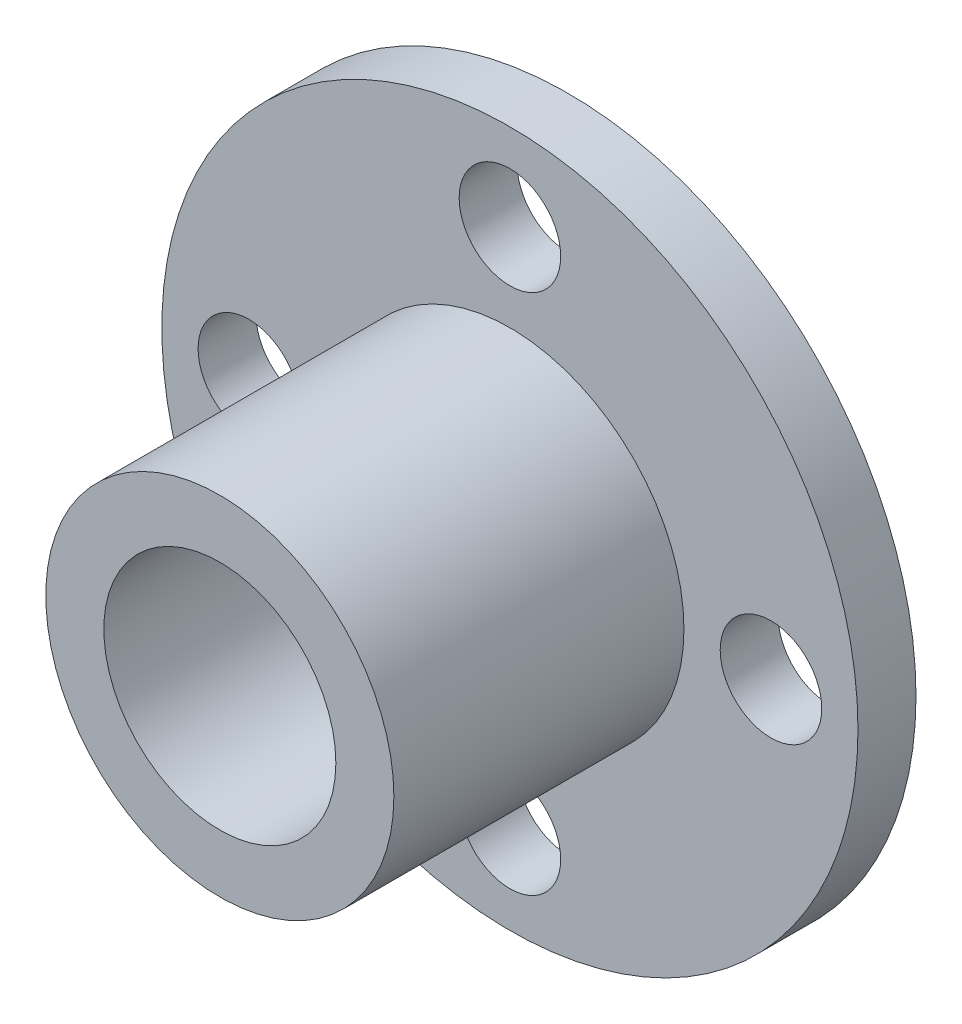
ISO-10303-21;
HEADER;
FILE_DESCRIPTION(('STEP AP214'),'2;1');
FILE_NAME('part.step','',(''),(''),'','','');
FILE_SCHEMA(('AUTOMOTIVE_DESIGN { 1 0 10303 214 1 1 1 1 }'));
ENDSEC;
DATA;
#1=APPLICATION_CONTEXT('core data for automotive mechanical design processes');
#2=APPLICATION_PROTOCOL_DEFINITION('international standard','automotive_design',2000,#1);
#3=PRODUCT_CONTEXT('',#1,'mechanical');
#4=PRODUCT('Part','Part','',(#3));
#5=PRODUCT_RELATED_PRODUCT_CATEGORY('part','',(#4));
#6=PRODUCT_DEFINITION_FORMATION('','',#4);
#7=PRODUCT_DEFINITION_CONTEXT('part definition',#1,'design');
#8=PRODUCT_DEFINITION('design','',#6,#7);
#9=PRODUCT_DEFINITION_SHAPE('','',#8);
#10=(LENGTH_UNIT() NAMED_UNIT(*) SI_UNIT(.MILLI.,.METRE.));
#11=(NAMED_UNIT(*) PLANE_ANGLE_UNIT() SI_UNIT($,.RADIAN.));
#12=(NAMED_UNIT(*) SI_UNIT($,.STERADIAN.) SOLID_ANGLE_UNIT());
#13=UNCERTAINTY_MEASURE_WITH_UNIT(LENGTH_MEASURE(1.E-05),#10,'distance_accuracy_value','');
#14=(GEOMETRIC_REPRESENTATION_CONTEXT(3) GLOBAL_UNCERTAINTY_ASSIGNED_CONTEXT((#13)) GLOBAL_UNIT_ASSIGNED_CONTEXT((#10,
#11,#12)) REPRESENTATION_CONTEXT('',''));
#15=CARTESIAN_POINT('',(0.,0.,0.));
#16=DIRECTION('',(0.,0.,1.));
#17=DIRECTION('',(1.,0.,0.));
#18=AXIS2_PLACEMENT_3D('',#15,#16,#17);
#19=CARTESIAN_POINT('',(0.,0.,2.));
#20=DIRECTION('',(0.,0.,1.));
#21=DIRECTION('',(1.,0.,0.));
#22=AXIS2_PLACEMENT_3D('',#19,#20,#21);
#23=PLANE('',#22);
#24=CARTESIAN_POINT('',(-9.,0.,2.));
#25=DIRECTION('',(0.,0.,1.));
#26=DIRECTION('',(1.,0.,0.));
#27=AXIS2_PLACEMENT_3D('',#24,#25,#26);
#28=CIRCLE('',#27,1.75);
#29=CARTESIAN_POINT('',(-7.25,0.,2.));
#30=VERTEX_POINT('',#29);
#31=EDGE_CURVE('E57',#30,#30,#28,.T.);
#32=ORIENTED_EDGE('',*,*,#31,.F.);
#33=EDGE_LOOP('',(#32));
#34=FACE_BOUND('',#33,.T.);
#35=CARTESIAN_POINT('',(0.,9.,2.));
#36=DIRECTION('',(0.,0.,1.));
#37=DIRECTION('',(1.,0.,0.));
#38=AXIS2_PLACEMENT_3D('',#35,#36,#37);
#39=CIRCLE('',#38,1.75);
#40=CARTESIAN_POINT('',(1.75,9.,2.));
#41=VERTEX_POINT('',#40);
#42=EDGE_CURVE('E60',#41,#41,#39,.T.);
#43=ORIENTED_EDGE('',*,*,#42,.F.);
#44=EDGE_LOOP('',(#43));
#45=FACE_BOUND('',#44,.T.);
#46=CARTESIAN_POINT('',(9.,0.,2.));
#47=DIRECTION('',(0.,0.,1.));
#48=DIRECTION('',(1.,0.,0.));
#49=AXIS2_PLACEMENT_3D('',#46,#47,#48);
#50=CIRCLE('',#49,1.75);
#51=CARTESIAN_POINT('',(10.75,0.,2.));
#52=VERTEX_POINT('',#51);
#53=EDGE_CURVE('E63',#52,#52,#50,.T.);
#54=ORIENTED_EDGE('',*,*,#53,.F.);
#55=EDGE_LOOP('',(#54));
#56=FACE_BOUND('',#55,.T.);
#57=CARTESIAN_POINT('',(0.,-9.,2.));
#58=DIRECTION('',(0.,0.,1.));
#59=DIRECTION('',(1.,0.,0.));
#60=AXIS2_PLACEMENT_3D('',#57,#58,#59);
#61=CIRCLE('',#60,1.75);
#62=CARTESIAN_POINT('',(1.75000000000006,-9.,2.));
#63=VERTEX_POINT('',#62);
#64=EDGE_CURVE('E66',#63,#63,#61,.T.);
#65=ORIENTED_EDGE('',*,*,#64,.F.);
#66=EDGE_LOOP('',(#65));
#67=FACE_BOUND('',#66,.T.);
#68=CARTESIAN_POINT('',(0.,0.,2.));
#69=DIRECTION('',(0.,0.,1.));
#70=DIRECTION('',(1.,0.,0.));
#71=AXIS2_PLACEMENT_3D('',#68,#69,#70);
#72=CIRCLE('',#71,12.);
#73=CARTESIAN_POINT('',(12.,0.,2.));
#74=VERTEX_POINT('',#73);
#75=EDGE_CURVE('E10',#74,#74,#72,.T.);
#76=ORIENTED_EDGE('',*,*,#75,.T.);
#77=EDGE_LOOP('',(#76));
#78=FACE_BOUND('',#77,.T.);
#79=CARTESIAN_POINT('',(0.,0.,2.));
#80=DIRECTION('',(0.,0.,1.));
#81=DIRECTION('',(1.,0.,0.));
#82=AXIS2_PLACEMENT_3D('',#79,#80,#81);
#83=CIRCLE('',#82,6.);
#84=CARTESIAN_POINT('',(6.,0.,2.));
#85=VERTEX_POINT('',#84);
#86=EDGE_CURVE('E49',#85,#85,#83,.T.);
#87=ORIENTED_EDGE('',*,*,#86,.F.);
#88=EDGE_LOOP('',(#87));
#89=FACE_BOUND('',#88,.T.);
#90=ADVANCED_FACE('F33',(#34,#45,#56,#67,#78,#89),#23,.T.);
#91=CARTESIAN_POINT('',(0.,0.,0.));
#92=DIRECTION('',(0.,0.,1.));
#93=DIRECTION('',(1.,0.,0.));
#94=AXIS2_PLACEMENT_3D('',#91,#92,#93);
#95=PLANE('',#94);
#96=CARTESIAN_POINT('',(-9.,0.,0.));
#97=DIRECTION('',(0.,0.,-1.));
#98=DIRECTION('',(-1.,0.,0.));
#99=AXIS2_PLACEMENT_3D('',#96,#97,#98);
#100=CIRCLE('',#99,1.75);
#101=CARTESIAN_POINT('',(-10.75,0.,0.));
#102=VERTEX_POINT('',#101);
#103=EDGE_CURVE('E69',#102,#102,#100,.T.);
#104=ORIENTED_EDGE('',*,*,#103,.F.);
#105=EDGE_LOOP('',(#104));
#106=FACE_BOUND('',#105,.T.);
#107=CARTESIAN_POINT('',(0.,9.,0.));
#108=DIRECTION('',(0.,0.,-1.));
#109=DIRECTION('',(-1.,0.,0.));
#110=AXIS2_PLACEMENT_3D('',#107,#108,#109);
#111=CIRCLE('',#110,1.75);
#112=CARTESIAN_POINT('',(-1.75,9.,0.));
#113=VERTEX_POINT('',#112);
#114=EDGE_CURVE('E76',#113,#113,#111,.T.);
#115=ORIENTED_EDGE('',*,*,#114,.F.);
#116=EDGE_LOOP('',(#115));
#117=FACE_BOUND('',#116,.T.);
#118=CARTESIAN_POINT('',(9.,0.,0.));
#119=DIRECTION('',(0.,0.,-1.));
#120=DIRECTION('',(-1.,0.,0.));
#121=AXIS2_PLACEMENT_3D('',#118,#119,#120);
#122=CIRCLE('',#121,1.75);
#123=CARTESIAN_POINT('',(7.25,0.,0.));
#124=VERTEX_POINT('',#123);
#125=EDGE_CURVE('E73',#124,#124,#122,.T.);
#126=ORIENTED_EDGE('',*,*,#125,.F.);
#127=EDGE_LOOP('',(#126));
#128=FACE_BOUND('',#127,.T.);
#129=CARTESIAN_POINT('',(0.,-9.,0.));
#130=DIRECTION('',(0.,0.,-1.));
#131=DIRECTION('',(-1.,0.,0.));
#132=AXIS2_PLACEMENT_3D('',#129,#130,#131);
#133=CIRCLE('',#132,1.75);
#134=CARTESIAN_POINT('',(-1.74999999999994,-9.,0.));
#135=VERTEX_POINT('',#134);
#136=EDGE_CURVE('E70',#135,#135,#133,.T.);
#137=ORIENTED_EDGE('',*,*,#136,.F.);
#138=EDGE_LOOP('',(#137));
#139=FACE_BOUND('',#138,.T.);
#140=CARTESIAN_POINT('',(0.,0.,0.));
#141=DIRECTION('',(0.,0.,1.));
#142=DIRECTION('',(1.,0.,0.));
#143=AXIS2_PLACEMENT_3D('',#140,#141,#142);
#144=CIRCLE('',#143,12.);
#145=CARTESIAN_POINT('',(12.,0.,0.));
#146=VERTEX_POINT('',#145);
#147=EDGE_CURVE('E37',#146,#146,#144,.T.);
#148=ORIENTED_EDGE('',*,*,#147,.F.);
#149=EDGE_LOOP('',(#148));
#150=FACE_BOUND('',#149,.T.);
#151=CARTESIAN_POINT('',(0.,0.,0.));
#152=DIRECTION('',(0.,0.,1.));
#153=DIRECTION('',(1.,0.,0.));
#154=AXIS2_PLACEMENT_3D('',#151,#152,#153);
#155=CIRCLE('',#154,4.);
#156=CARTESIAN_POINT('',(4.,0.,0.));
#157=VERTEX_POINT('',#156);
#158=EDGE_CURVE('E44',#157,#157,#155,.T.);
#159=ORIENTED_EDGE('',*,*,#158,.T.);
#160=EDGE_LOOP('',(#159));
#161=FACE_BOUND('',#160,.T.);
#162=ADVANCED_FACE('F84',(#106,#117,#128,#139,#150,#161),#95,.F.);
#163=CARTESIAN_POINT('',(0.,0.,2.));
#164=DIRECTION('',(0.,0.,-1.));
#165=DIRECTION('',(-1.,0.,0.));
#166=AXIS2_PLACEMENT_3D('',#163,#164,#165);
#167=CYLINDRICAL_SURFACE('',#166,12.);
#168=ORIENTED_EDGE('',*,*,#75,.F.);
#169=EDGE_LOOP('',(#168));
#170=FACE_BOUND('',#169,.T.);
#171=ORIENTED_EDGE('',*,*,#147,.T.);
#172=EDGE_LOOP('',(#171));
#173=FACE_BOUND('',#172,.T.);
#174=ADVANCED_FACE('F35',(#170,#173),#167,.T.);
#175=CARTESIAN_POINT('',(0.,0.,2.));
#176=DIRECTION('',(0.,0.,-1.));
#177=DIRECTION('',(-1.,0.,0.));
#178=AXIS2_PLACEMENT_3D('',#175,#176,#177);
#179=CYLINDRICAL_SURFACE('',#178,4.);
#180=ORIENTED_EDGE('',*,*,#158,.F.);
#181=EDGE_LOOP('',(#180));
#182=FACE_BOUND('',#181,.T.);
#183=CARTESIAN_POINT('',(0.,0.,12.));
#184=DIRECTION('',(0.,0.,1.));
#185=DIRECTION('',(1.,0.,0.));
#186=AXIS2_PLACEMENT_3D('',#183,#184,#185);
#187=CIRCLE('',#186,4.);
#188=CARTESIAN_POINT('',(4.,0.,12.));
#189=VERTEX_POINT('',#188);
#190=EDGE_CURVE('E52',#189,#189,#187,.T.);
#191=ORIENTED_EDGE('',*,*,#190,.T.);
#192=EDGE_LOOP('',(#191));
#193=FACE_BOUND('',#192,.T.);
#194=ADVANCED_FACE('F97',(#182,#193),#179,.F.);
#195=CARTESIAN_POINT('',(0.,0.,12.));
#196=DIRECTION('',(0.,0.,1.));
#197=DIRECTION('',(1.,0.,0.));
#198=AXIS2_PLACEMENT_3D('',#195,#196,#197);
#199=PLANE('',#198);
#200=CARTESIAN_POINT('',(0.,0.,12.));
#201=DIRECTION('',(0.,0.,1.));
#202=DIRECTION('',(1.,0.,0.));
#203=AXIS2_PLACEMENT_3D('',#200,#201,#202);
#204=CIRCLE('',#203,6.);
#205=CARTESIAN_POINT('',(6.,0.,12.));
#206=VERTEX_POINT('',#205);
#207=EDGE_CURVE('E48',#206,#206,#204,.T.);
#208=ORIENTED_EDGE('',*,*,#207,.T.);
#209=EDGE_LOOP('',(#208));
#210=FACE_BOUND('',#209,.T.);
#211=ORIENTED_EDGE('',*,*,#190,.F.);
#212=EDGE_LOOP('',(#211));
#213=FACE_BOUND('',#212,.T.);
#214=ADVANCED_FACE('F100',(#210,#213),#199,.T.);
#215=CARTESIAN_POINT('',(0.,0.,12.));
#216=DIRECTION('',(0.,0.,-1.));
#217=DIRECTION('',(-1.,0.,0.));
#218=AXIS2_PLACEMENT_3D('',#215,#216,#217);
#219=CYLINDRICAL_SURFACE('',#218,6.);
#220=ORIENTED_EDGE('',*,*,#207,.F.);
#221=EDGE_LOOP('',(#220));
#222=FACE_BOUND('',#221,.T.);
#223=ORIENTED_EDGE('',*,*,#86,.T.);
#224=EDGE_LOOP('',(#223));
#225=FACE_BOUND('',#224,.T.);
#226=ADVANCED_FACE('F105',(#222,#225),#219,.T.);
#227=CARTESIAN_POINT('',(0.,-9.,16.7));
#228=DIRECTION('',(0.,0.,-1.));
#229=DIRECTION('',(-1.,0.,0.));
#230=AXIS2_PLACEMENT_3D('',#227,#228,#229);
#231=CYLINDRICAL_SURFACE('',#230,1.75);
#232=ORIENTED_EDGE('',*,*,#64,.T.);
#233=EDGE_LOOP('',(#232));
#234=FACE_BOUND('',#233,.T.);
#235=ORIENTED_EDGE('',*,*,#136,.T.);
#236=EDGE_LOOP('',(#235));
#237=FACE_BOUND('',#236,.T.);
#238=ADVANCED_FACE('F111',(#234,#237),#231,.F.);
#239=CARTESIAN_POINT('',(9.,0.,16.7));
#240=DIRECTION('',(0.,0.,-1.));
#241=DIRECTION('',(-1.,0.,0.));
#242=AXIS2_PLACEMENT_3D('',#239,#240,#241);
#243=CYLINDRICAL_SURFACE('',#242,1.75);
#244=ORIENTED_EDGE('',*,*,#53,.T.);
#245=EDGE_LOOP('',(#244));
#246=FACE_BOUND('',#245,.T.);
#247=ORIENTED_EDGE('',*,*,#125,.T.);
#248=EDGE_LOOP('',(#247));
#249=FACE_BOUND('',#248,.T.);
#250=ADVANCED_FACE('F133',(#246,#249),#243,.F.);
#251=CARTESIAN_POINT('',(0.,9.,16.7));
#252=DIRECTION('',(0.,0.,-1.));
#253=DIRECTION('',(-1.,0.,0.));
#254=AXIS2_PLACEMENT_3D('',#251,#252,#253);
#255=CYLINDRICAL_SURFACE('',#254,1.75);
#256=ORIENTED_EDGE('',*,*,#42,.T.);
#257=EDGE_LOOP('',(#256));
#258=FACE_BOUND('',#257,.T.);
#259=ORIENTED_EDGE('',*,*,#114,.T.);
#260=EDGE_LOOP('',(#259));
#261=FACE_BOUND('',#260,.T.);
#262=ADVANCED_FACE('F137',(#258,#261),#255,.F.);
#263=CARTESIAN_POINT('',(-9.,0.,16.7));
#264=DIRECTION('',(0.,0.,-1.));
#265=DIRECTION('',(-1.,0.,0.));
#266=AXIS2_PLACEMENT_3D('',#263,#264,#265);
#267=CYLINDRICAL_SURFACE('',#266,1.75);
#268=ORIENTED_EDGE('',*,*,#31,.T.);
#269=EDGE_LOOP('',(#268));
#270=FACE_BOUND('',#269,.T.);
#271=ORIENTED_EDGE('',*,*,#103,.T.);
#272=EDGE_LOOP('',(#271));
#273=FACE_BOUND('',#272,.T.);
#274=ADVANCED_FACE('F82',(#270,#273),#267,.F.);
#275=CLOSED_SHELL('',(#90,#162,#174,#194,#214,#226,#238,#250,#262,#274));
#276=MANIFOLD_SOLID_BREP('B2',#275);
#277=ADVANCED_BREP_SHAPE_REPRESENTATION('',(#18,#276),#14);
#278=SHAPE_DEFINITION_REPRESENTATION(#9,#277);
ENDSEC;
END-ISO-10303-21;
